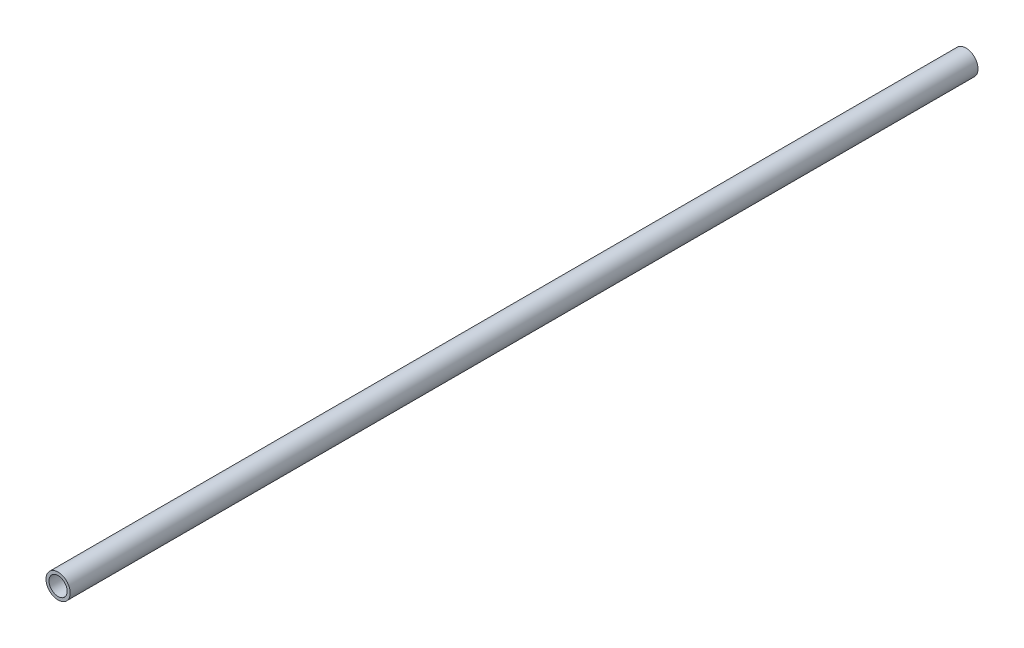
ISO-10303-21;
HEADER;
FILE_DESCRIPTION(('STEP AP214'),'2;1');
FILE_NAME('part.step','',(''),(''),'','','');
FILE_SCHEMA(('AUTOMOTIVE_DESIGN { 1 0 10303 214 1 1 1 1 }'));
ENDSEC;
DATA;
#1=APPLICATION_CONTEXT('core data for automotive mechanical design processes');
#2=APPLICATION_PROTOCOL_DEFINITION('international standard','automotive_design',2000,#1);
#3=PRODUCT_CONTEXT('',#1,'mechanical');
#4=PRODUCT('Part','Part','',(#3));
#5=PRODUCT_RELATED_PRODUCT_CATEGORY('part','',(#4));
#6=PRODUCT_DEFINITION_FORMATION('','',#4);
#7=PRODUCT_DEFINITION_CONTEXT('part definition',#1,'design');
#8=PRODUCT_DEFINITION('design','',#6,#7);
#9=PRODUCT_DEFINITION_SHAPE('','',#8);
#10=(LENGTH_UNIT() NAMED_UNIT(*) SI_UNIT(.MILLI.,.METRE.));
#11=(NAMED_UNIT(*) PLANE_ANGLE_UNIT() SI_UNIT($,.RADIAN.));
#12=(NAMED_UNIT(*) SI_UNIT($,.STERADIAN.) SOLID_ANGLE_UNIT());
#13=UNCERTAINTY_MEASURE_WITH_UNIT(LENGTH_MEASURE(1.E-05),#10,'distance_accuracy_value','');
#14=(GEOMETRIC_REPRESENTATION_CONTEXT(3) GLOBAL_UNCERTAINTY_ASSIGNED_CONTEXT((#13)) GLOBAL_UNIT_ASSIGNED_CONTEXT((#10,
#11,#12)) REPRESENTATION_CONTEXT('',''));
#15=CARTESIAN_POINT('',(0.,0.,0.));
#16=DIRECTION('',(0.,0.,1.));
#17=DIRECTION('',(1.,0.,0.));
#18=AXIS2_PLACEMENT_3D('',#15,#16,#17);
#19=CARTESIAN_POINT('',(0.,0.,300.));
#20=DIRECTION('',(0.,0.,1.));
#21=DIRECTION('',(1.,0.,0.));
#22=AXIS2_PLACEMENT_3D('',#19,#20,#21);
#23=PLANE('',#22);
#24=CARTESIAN_POINT('',(0.,0.,300.));
#25=DIRECTION('',(0.,0.,1.));
#26=DIRECTION('',(1.,0.,0.));
#27=AXIS2_PLACEMENT_3D('',#24,#25,#26);
#28=CIRCLE('',#27,4.);
#29=CARTESIAN_POINT('',(4.,0.,300.));
#30=VERTEX_POINT('',#29);
#31=EDGE_CURVE('E11',#30,#30,#28,.T.);
#32=ORIENTED_EDGE('',*,*,#31,.T.);
#33=EDGE_LOOP('',(#32));
#34=FACE_BOUND('',#33,.T.);
#35=CARTESIAN_POINT('',(0.,0.,300.));
#36=DIRECTION('',(0.,0.,1.));
#37=DIRECTION('',(1.,0.,0.));
#38=AXIS2_PLACEMENT_3D('',#35,#36,#37);
#39=CIRCLE('',#38,3.);
#40=CARTESIAN_POINT('',(3.,0.,300.));
#41=VERTEX_POINT('',#40);
#42=EDGE_CURVE('E60',#41,#41,#39,.T.);
#43=ORIENTED_EDGE('',*,*,#42,.F.);
#44=EDGE_LOOP('',(#43));
#45=FACE_BOUND('',#44,.T.);
#46=ADVANCED_FACE('F47',(#34,#45),#23,.T.);
#47=CARTESIAN_POINT('',(0.,0.,0.));
#48=DIRECTION('',(0.,0.,1.));
#49=DIRECTION('',(1.,0.,0.));
#50=AXIS2_PLACEMENT_3D('',#47,#48,#49);
#51=PLANE('',#50);
#52=CARTESIAN_POINT('',(0.,0.,0.));
#53=DIRECTION('',(0.,0.,1.));
#54=DIRECTION('',(1.,0.,0.));
#55=AXIS2_PLACEMENT_3D('',#52,#53,#54);
#56=CIRCLE('',#55,4.);
#57=CARTESIAN_POINT('',(4.,0.,0.));
#58=VERTEX_POINT('',#57);
#59=EDGE_CURVE('E51',#58,#58,#56,.T.);
#60=ORIENTED_EDGE('',*,*,#59,.F.);
#61=EDGE_LOOP('',(#60));
#62=FACE_BOUND('',#61,.T.);
#63=CARTESIAN_POINT('',(0.,0.,0.));
#64=DIRECTION('',(0.,0.,1.));
#65=DIRECTION('',(1.,0.,0.));
#66=AXIS2_PLACEMENT_3D('',#63,#64,#65);
#67=CIRCLE('',#66,3.);
#68=CARTESIAN_POINT('',(3.,0.,0.));
#69=VERTEX_POINT('',#68);
#70=EDGE_CURVE('E62',#69,#69,#67,.T.);
#71=ORIENTED_EDGE('',*,*,#70,.T.);
#72=EDGE_LOOP('',(#71));
#73=FACE_BOUND('',#72,.T.);
#74=ADVANCED_FACE('F74',(#62,#73),#51,.F.);
#75=CARTESIAN_POINT('',(0.,0.,300.));
#76=DIRECTION('',(0.,0.,-1.));
#77=DIRECTION('',(-1.,0.,0.));
#78=AXIS2_PLACEMENT_3D('',#75,#76,#77);
#79=CYLINDRICAL_SURFACE('',#78,4.);
#80=ORIENTED_EDGE('',*,*,#31,.F.);
#81=EDGE_LOOP('',(#80));
#82=FACE_BOUND('',#81,.T.);
#83=ORIENTED_EDGE('',*,*,#59,.T.);
#84=EDGE_LOOP('',(#83));
#85=FACE_BOUND('',#84,.T.);
#86=ADVANCED_FACE('F49',(#82,#85),#79,.T.);
#87=CARTESIAN_POINT('',(0.,0.,300.));
#88=DIRECTION('',(0.,0.,-1.));
#89=DIRECTION('',(-1.,0.,0.));
#90=AXIS2_PLACEMENT_3D('',#87,#88,#89);
#91=CYLINDRICAL_SURFACE('',#90,3.);
#92=ORIENTED_EDGE('',*,*,#42,.T.);
#93=EDGE_LOOP('',(#92));
#94=FACE_BOUND('',#93,.T.);
#95=ORIENTED_EDGE('',*,*,#70,.F.);
#96=EDGE_LOOP('',(#95));
#97=FACE_BOUND('',#96,.T.);
#98=ADVANCED_FACE('F70',(#94,#97),#91,.F.);
#99=CLOSED_SHELL('',(#46,#74,#86,#98));
#100=MANIFOLD_SOLID_BREP('B2',#99);
#101=ADVANCED_BREP_SHAPE_REPRESENTATION('',(#18,#100),#14);
#102=SHAPE_DEFINITION_REPRESENTATION(#9,#101);
ENDSEC;
END-ISO-10303-21;
